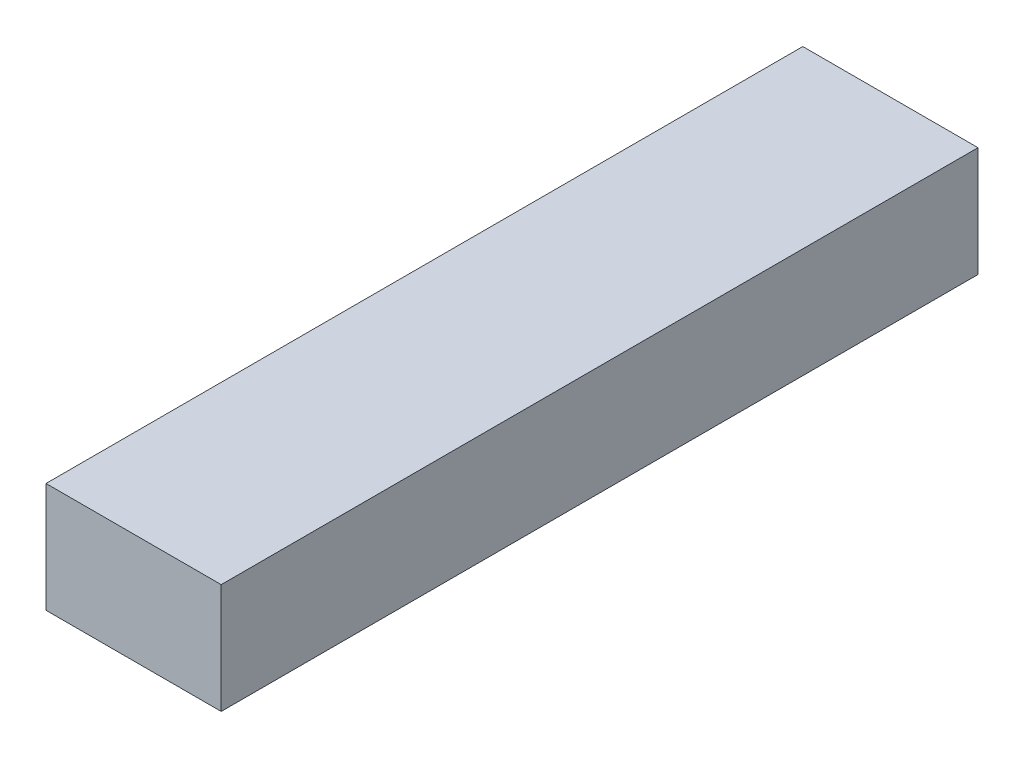
ISO-10303-21;
HEADER;
FILE_DESCRIPTION(('STEP AP214'),'2;1');
FILE_NAME('part.step','',(''),(''),'','','');
FILE_SCHEMA(('AUTOMOTIVE_DESIGN { 1 0 10303 214 1 1 1 1 }'));
ENDSEC;
DATA;
#1=APPLICATION_CONTEXT('core data for automotive mechanical design processes');
#2=APPLICATION_PROTOCOL_DEFINITION('international standard','automotive_design',2000,#1);
#3=PRODUCT_CONTEXT('',#1,'mechanical');
#4=PRODUCT('Part','Part','',(#3));
#5=PRODUCT_RELATED_PRODUCT_CATEGORY('part','',(#4));
#6=PRODUCT_DEFINITION_FORMATION('','',#4);
#7=PRODUCT_DEFINITION_CONTEXT('part definition',#1,'design');
#8=PRODUCT_DEFINITION('design','',#6,#7);
#9=PRODUCT_DEFINITION_SHAPE('','',#8);
#10=(LENGTH_UNIT() NAMED_UNIT(*) SI_UNIT(.MILLI.,.METRE.));
#11=(NAMED_UNIT(*) PLANE_ANGLE_UNIT() SI_UNIT($,.RADIAN.));
#12=(NAMED_UNIT(*) SI_UNIT($,.STERADIAN.) SOLID_ANGLE_UNIT());
#13=UNCERTAINTY_MEASURE_WITH_UNIT(LENGTH_MEASURE(1.E-05),#10,'distance_accuracy_value','');
#14=(GEOMETRIC_REPRESENTATION_CONTEXT(3) GLOBAL_UNCERTAINTY_ASSIGNED_CONTEXT((#13)) GLOBAL_UNIT_ASSIGNED_CONTEXT((#10,
#11,#12)) REPRESENTATION_CONTEXT('',''));
#15=CARTESIAN_POINT('',(0.,0.,0.));
#16=DIRECTION('',(0.,0.,1.));
#17=DIRECTION('',(1.,0.,0.));
#18=AXIS2_PLACEMENT_3D('',#15,#16,#17);
#19=CARTESIAN_POINT('',(4499.999999982,5643.,7656.461));
#20=DIRECTION('',(0.,0.,-1.));
#21=DIRECTION('',(0.,1.,0.));
#22=AXIS2_PLACEMENT_3D('',#19,#20,#21);
#23=PLANE('',#22);
#24=DIRECTION('',(0.,-1.,0.));
#25=VECTOR('',#24,1.);
#26=CARTESIAN_POINT('',(-4499.999999982,5643.,7656.461));
#27=LINE('',#26,#25);
#28=CARTESIAN_POINT('',(-4499.999999982,5643.,7656.461));
#29=VERTEX_POINT('',#28);
#30=CARTESIAN_POINT('',(-4499.999999982,0.,7656.461));
#31=VERTEX_POINT('',#30);
#32=EDGE_CURVE('E108',#29,#31,#27,.T.);
#33=ORIENTED_EDGE('',*,*,#32,.T.);
#34=DIRECTION('',(-1.,0.,0.));
#35=VECTOR('',#34,1.);
#36=CARTESIAN_POINT('',(4499.999999982,0.,7656.461));
#37=LINE('',#36,#35);
#38=CARTESIAN_POINT('',(4499.999999982,0.,7656.461));
#39=VERTEX_POINT('',#38);
#40=EDGE_CURVE('E11',#39,#31,#37,.T.);
#41=ORIENTED_EDGE('',*,*,#40,.F.);
#42=DIRECTION('',(0.,-1.,0.));
#43=VECTOR('',#42,1.);
#44=CARTESIAN_POINT('',(4499.999999982,5643.,7656.461));
#45=LINE('',#44,#43);
#46=CARTESIAN_POINT('',(4499.999999982,5643.,7656.461));
#47=VERTEX_POINT('',#46);
#48=EDGE_CURVE('E96',#47,#39,#45,.T.);
#49=ORIENTED_EDGE('',*,*,#48,.F.);
#50=DIRECTION('',(-1.,0.,0.));
#51=VECTOR('',#50,1.);
#52=CARTESIAN_POINT('',(4499.999999982,5643.,7656.461));
#53=LINE('',#52,#51);
#54=EDGE_CURVE('E104',#47,#29,#53,.T.);
#55=ORIENTED_EDGE('',*,*,#54,.T.);
#56=EDGE_LOOP('',(#33,#41,#49,#55));
#57=FACE_BOUND('',#56,.T.);
#58=ADVANCED_FACE('F45',(#57),#23,.F.);
#59=CARTESIAN_POINT('',(4499.999999982,0.,7656.461));
#60=DIRECTION('',(0.,1.,0.));
#61=DIRECTION('',(0.,0.,1.));
#62=AXIS2_PLACEMENT_3D('',#59,#60,#61);
#63=PLANE('',#62);
#64=DIRECTION('',(0.,0.,-1.));
#65=VECTOR('',#64,1.);
#66=CARTESIAN_POINT('',(-4499.999999982,0.,7656.461));
#67=LINE('',#66,#65);
#68=CARTESIAN_POINT('',(-4499.999999982,0.,-31218.375));
#69=VERTEX_POINT('',#68);
#70=EDGE_CURVE('E100',#31,#69,#67,.T.);
#71=ORIENTED_EDGE('',*,*,#70,.T.);
#72=DIRECTION('',(-1.,0.,0.));
#73=VECTOR('',#72,1.);
#74=CARTESIAN_POINT('',(4499.999999982,0.,-31218.375));
#75=LINE('',#74,#73);
#76=CARTESIAN_POINT('',(4499.999999982,0.,-31218.375));
#77=VERTEX_POINT('',#76);
#78=EDGE_CURVE('E53',#77,#69,#75,.T.);
#79=ORIENTED_EDGE('',*,*,#78,.F.);
#80=DIRECTION('',(0.,0.,-1.));
#81=VECTOR('',#80,1.);
#82=CARTESIAN_POINT('',(4499.999999982,0.,7656.461));
#83=LINE('',#82,#81);
#84=EDGE_CURVE('E91',#39,#77,#83,.T.);
#85=ORIENTED_EDGE('',*,*,#84,.F.);
#86=ORIENTED_EDGE('',*,*,#40,.T.);
#87=EDGE_LOOP('',(#71,#79,#85,#86));
#88=FACE_BOUND('',#87,.T.);
#89=ADVANCED_FACE('F99',(#88),#63,.F.);
#90=CARTESIAN_POINT('',(4499.999999982,5643.,-31218.375));
#91=DIRECTION('',(0.,0.,1.));
#92=DIRECTION('',(0.,-1.,0.));
#93=AXIS2_PLACEMENT_3D('',#90,#91,#92);
#94=PLANE('',#93);
#95=DIRECTION('',(0.,1.,0.));
#96=VECTOR('',#95,1.);
#97=CARTESIAN_POINT('',(-4499.999999982,5643.,-31218.375));
#98=LINE('',#97,#96);
#99=CARTESIAN_POINT('',(-4499.999999982,5643.,-31218.375));
#100=VERTEX_POINT('',#99);
#101=EDGE_CURVE('E78',#69,#100,#98,.T.);
#102=ORIENTED_EDGE('',*,*,#101,.T.);
#103=DIRECTION('',(-1.,0.,0.));
#104=VECTOR('',#103,1.);
#105=CARTESIAN_POINT('',(4499.999999982,5643.,-31218.375));
#106=LINE('',#105,#104);
#107=CARTESIAN_POINT('',(4499.999999982,5643.,-31218.375));
#108=VERTEX_POINT('',#107);
#109=EDGE_CURVE('E101',#108,#100,#106,.T.);
#110=ORIENTED_EDGE('',*,*,#109,.F.);
#111=DIRECTION('',(0.,1.,0.));
#112=VECTOR('',#111,1.);
#113=CARTESIAN_POINT('',(4499.999999982,5643.,-31218.375));
#114=LINE('',#113,#112);
#115=EDGE_CURVE('E94',#77,#108,#114,.T.);
#116=ORIENTED_EDGE('',*,*,#115,.F.);
#117=ORIENTED_EDGE('',*,*,#78,.T.);
#118=EDGE_LOOP('',(#102,#110,#116,#117));
#119=FACE_BOUND('',#118,.T.);
#120=ADVANCED_FACE('F102',(#119),#94,.F.);
#121=CARTESIAN_POINT('',(4499.999999982,5643.,7656.461));
#122=DIRECTION('',(0.,-1.,0.));
#123=DIRECTION('',(0.,0.,-1.));
#124=AXIS2_PLACEMENT_3D('',#121,#122,#123);
#125=PLANE('',#124);
#126=DIRECTION('',(0.,0.,1.));
#127=VECTOR('',#126,1.);
#128=CARTESIAN_POINT('',(-4499.999999982,5643.,7656.461));
#129=LINE('',#128,#127);
#130=EDGE_CURVE('E84',#100,#29,#129,.T.);
#131=ORIENTED_EDGE('',*,*,#130,.T.);
#132=ORIENTED_EDGE('',*,*,#54,.F.);
#133=DIRECTION('',(0.,0.,1.));
#134=VECTOR('',#133,1.);
#135=CARTESIAN_POINT('',(4499.999999982,5643.,7656.461));
#136=LINE('',#135,#134);
#137=EDGE_CURVE('E61',#108,#47,#136,.T.);
#138=ORIENTED_EDGE('',*,*,#137,.F.);
#139=ORIENTED_EDGE('',*,*,#109,.T.);
#140=EDGE_LOOP('',(#131,#132,#138,#139));
#141=FACE_BOUND('',#140,.T.);
#142=ADVANCED_FACE('F115',(#141),#125,.F.);
#143=CARTESIAN_POINT('',(4499.999999982,0.,0.));
#144=DIRECTION('',(1.,0.,0.));
#145=DIRECTION('',(0.,0.,-1.));
#146=AXIS2_PLACEMENT_3D('',#143,#144,#145);
#147=PLANE('',#146);
#148=ORIENTED_EDGE('',*,*,#48,.T.);
#149=ORIENTED_EDGE('',*,*,#84,.T.);
#150=ORIENTED_EDGE('',*,*,#115,.T.);
#151=ORIENTED_EDGE('',*,*,#137,.T.);
#152=EDGE_LOOP('',(#148,#149,#150,#151));
#153=FACE_BOUND('',#152,.T.);
#154=ADVANCED_FACE('F92',(#153),#147,.T.);
#155=CARTESIAN_POINT('',(-4499.999999982,0.,0.));
#156=DIRECTION('',(1.,0.,0.));
#157=DIRECTION('',(0.,0.,-1.));
#158=AXIS2_PLACEMENT_3D('',#155,#156,#157);
#159=PLANE('',#158);
#160=ORIENTED_EDGE('',*,*,#32,.F.);
#161=ORIENTED_EDGE('',*,*,#130,.F.);
#162=ORIENTED_EDGE('',*,*,#101,.F.);
#163=ORIENTED_EDGE('',*,*,#70,.F.);
#164=EDGE_LOOP('',(#160,#161,#162,#163));
#165=FACE_BOUND('',#164,.T.);
#166=ADVANCED_FACE('F118',(#165),#159,.F.);
#167=CLOSED_SHELL('',(#58,#89,#120,#142,#154,#166));
#168=MANIFOLD_SOLID_BREP('B2',#167);
#169=ADVANCED_BREP_SHAPE_REPRESENTATION('',(#18,#168),#14);
#170=SHAPE_DEFINITION_REPRESENTATION(#9,#169);
ENDSEC;
END-ISO-10303-21;
